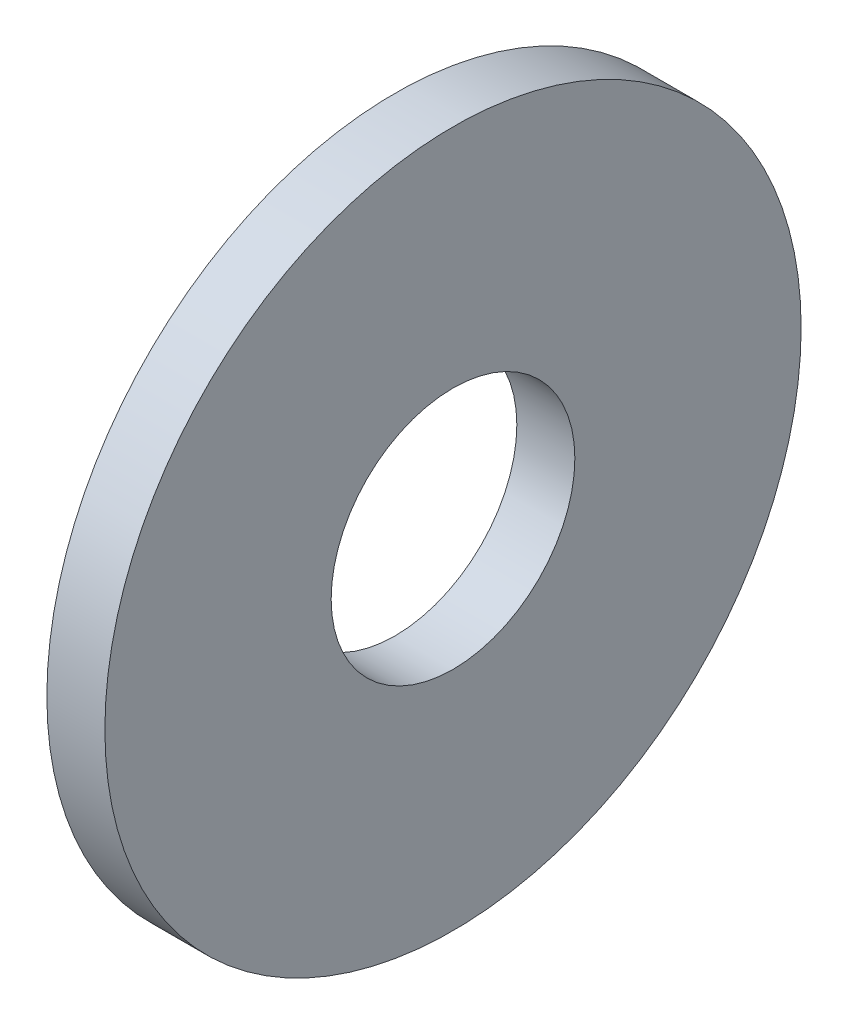
ISO-10303-21;
HEADER;
FILE_DESCRIPTION(('STEP AP214'),'2;1');
FILE_NAME('part.step','',(''),(''),'','','');
FILE_SCHEMA(('AUTOMOTIVE_DESIGN { 1 0 10303 214 1 1 1 1 }'));
ENDSEC;
DATA;
#1=APPLICATION_CONTEXT('core data for automotive mechanical design processes');
#2=APPLICATION_PROTOCOL_DEFINITION('international standard','automotive_design',2000,#1);
#3=PRODUCT_CONTEXT('',#1,'mechanical');
#4=PRODUCT('Part','Part','',(#3));
#5=PRODUCT_RELATED_PRODUCT_CATEGORY('part','',(#4));
#6=PRODUCT_DEFINITION_FORMATION('','',#4);
#7=PRODUCT_DEFINITION_CONTEXT('part definition',#1,'design');
#8=PRODUCT_DEFINITION('design','',#6,#7);
#9=PRODUCT_DEFINITION_SHAPE('','',#8);
#10=(LENGTH_UNIT() NAMED_UNIT(*) SI_UNIT(.MILLI.,.METRE.));
#11=(NAMED_UNIT(*) PLANE_ANGLE_UNIT() SI_UNIT($,.RADIAN.));
#12=(NAMED_UNIT(*) SI_UNIT($,.STERADIAN.) SOLID_ANGLE_UNIT());
#13=UNCERTAINTY_MEASURE_WITH_UNIT(LENGTH_MEASURE(1.E-05),#10,'distance_accuracy_value','');
#14=(GEOMETRIC_REPRESENTATION_CONTEXT(3) GLOBAL_UNCERTAINTY_ASSIGNED_CONTEXT((#13)) GLOBAL_UNIT_ASSIGNED_CONTEXT((#10,
#11,#12)) REPRESENTATION_CONTEXT('',''));
#15=CARTESIAN_POINT('',(0.,0.,0.));
#16=DIRECTION('',(0.,0.,1.));
#17=DIRECTION('',(1.,0.,0.));
#18=AXIS2_PLACEMENT_3D('',#15,#16,#17);
#19=CARTESIAN_POINT('',(-34.9249999999999,0.,0.));
#20=DIRECTION('',(-1.,0.,0.));
#21=DIRECTION('',(0.,0.,1.));
#22=AXIS2_PLACEMENT_3D('',#19,#20,#21);
#23=CYLINDRICAL_SURFACE('',#22,5.25);
#24=CARTESIAN_POINT('',(0.,0.,0.));
#25=DIRECTION('',(-1.,0.,0.));
#26=DIRECTION('',(0.,0.,1.));
#27=AXIS2_PLACEMENT_3D('',#24,#25,#26);
#28=CIRCLE('',#27,5.25);
#29=CARTESIAN_POINT('',(0.,0.,5.25));
#30=VERTEX_POINT('',#29);
#31=EDGE_CURVE('E10',#30,#30,#28,.T.);
#32=ORIENTED_EDGE('',*,*,#31,.F.);
#33=EDGE_LOOP('',(#32));
#34=FACE_BOUND('',#33,.T.);
#35=CARTESIAN_POINT('',(-2.5,0.,0.));
#36=DIRECTION('',(-1.,0.,0.));
#37=DIRECTION('',(0.,0.,1.));
#38=AXIS2_PLACEMENT_3D('',#35,#36,#37);
#39=CIRCLE('',#38,5.25);
#40=CARTESIAN_POINT('',(-2.5,0.,5.25));
#41=VERTEX_POINT('',#40);
#42=EDGE_CURVE('E45',#41,#41,#39,.T.);
#43=ORIENTED_EDGE('',*,*,#42,.T.);
#44=EDGE_LOOP('',(#43));
#45=FACE_BOUND('',#44,.T.);
#46=ADVANCED_FACE('F31',(#34,#45),#23,.F.);
#47=CARTESIAN_POINT('',(0.,5.25,0.));
#48=DIRECTION('',(-1.,0.,0.));
#49=DIRECTION('',(0.,0.,1.));
#50=AXIS2_PLACEMENT_3D('',#47,#48,#49);
#51=PLANE('',#50);
#52=CARTESIAN_POINT('',(0.,0.,0.));
#53=DIRECTION('',(-1.,0.,0.));
#54=DIRECTION('',(0.,0.,1.));
#55=AXIS2_PLACEMENT_3D('',#52,#53,#54);
#56=CIRCLE('',#55,15.);
#57=CARTESIAN_POINT('',(0.,0.,15.));
#58=VERTEX_POINT('',#57);
#59=EDGE_CURVE('E37',#58,#58,#56,.T.);
#60=ORIENTED_EDGE('',*,*,#59,.F.);
#61=EDGE_LOOP('',(#60));
#62=FACE_BOUND('',#61,.T.);
#63=ORIENTED_EDGE('',*,*,#31,.T.);
#64=EDGE_LOOP('',(#63));
#65=FACE_BOUND('',#64,.T.);
#66=ADVANCED_FACE('F60',(#62,#65),#51,.F.);
#67=CARTESIAN_POINT('',(-34.9249999999999,0.,0.));
#68=DIRECTION('',(-1.,0.,0.));
#69=DIRECTION('',(0.,0.,1.));
#70=AXIS2_PLACEMENT_3D('',#67,#68,#69);
#71=CYLINDRICAL_SURFACE('',#70,15.);
#72=CARTESIAN_POINT('',(-2.5,0.,0.));
#73=DIRECTION('',(-1.,0.,0.));
#74=DIRECTION('',(0.,0.,1.));
#75=AXIS2_PLACEMENT_3D('',#72,#73,#74);
#76=CIRCLE('',#75,15.);
#77=CARTESIAN_POINT('',(-2.5,0.,15.));
#78=VERTEX_POINT('',#77);
#79=EDGE_CURVE('E41',#78,#78,#76,.T.);
#80=ORIENTED_EDGE('',*,*,#79,.F.);
#81=EDGE_LOOP('',(#80));
#82=FACE_BOUND('',#81,.T.);
#83=ORIENTED_EDGE('',*,*,#59,.T.);
#84=EDGE_LOOP('',(#83));
#85=FACE_BOUND('',#84,.T.);
#86=ADVANCED_FACE('F55',(#82,#85),#71,.T.);
#87=CARTESIAN_POINT('',(-2.5,15.,0.));
#88=DIRECTION('',(1.,0.,0.));
#89=DIRECTION('',(0.,0.,-1.));
#90=AXIS2_PLACEMENT_3D('',#87,#88,#89);
#91=PLANE('',#90);
#92=ORIENTED_EDGE('',*,*,#42,.F.);
#93=EDGE_LOOP('',(#92));
#94=FACE_BOUND('',#93,.T.);
#95=ORIENTED_EDGE('',*,*,#79,.T.);
#96=EDGE_LOOP('',(#95));
#97=FACE_BOUND('',#96,.T.);
#98=ADVANCED_FACE('F52',(#94,#97),#91,.F.);
#99=CLOSED_SHELL('',(#46,#66,#86,#98));
#100=MANIFOLD_SOLID_BREP('B2',#99);
#101=ADVANCED_BREP_SHAPE_REPRESENTATION('',(#18,#100),#14);
#102=SHAPE_DEFINITION_REPRESENTATION(#9,#101);
ENDSEC;
END-ISO-10303-21;
